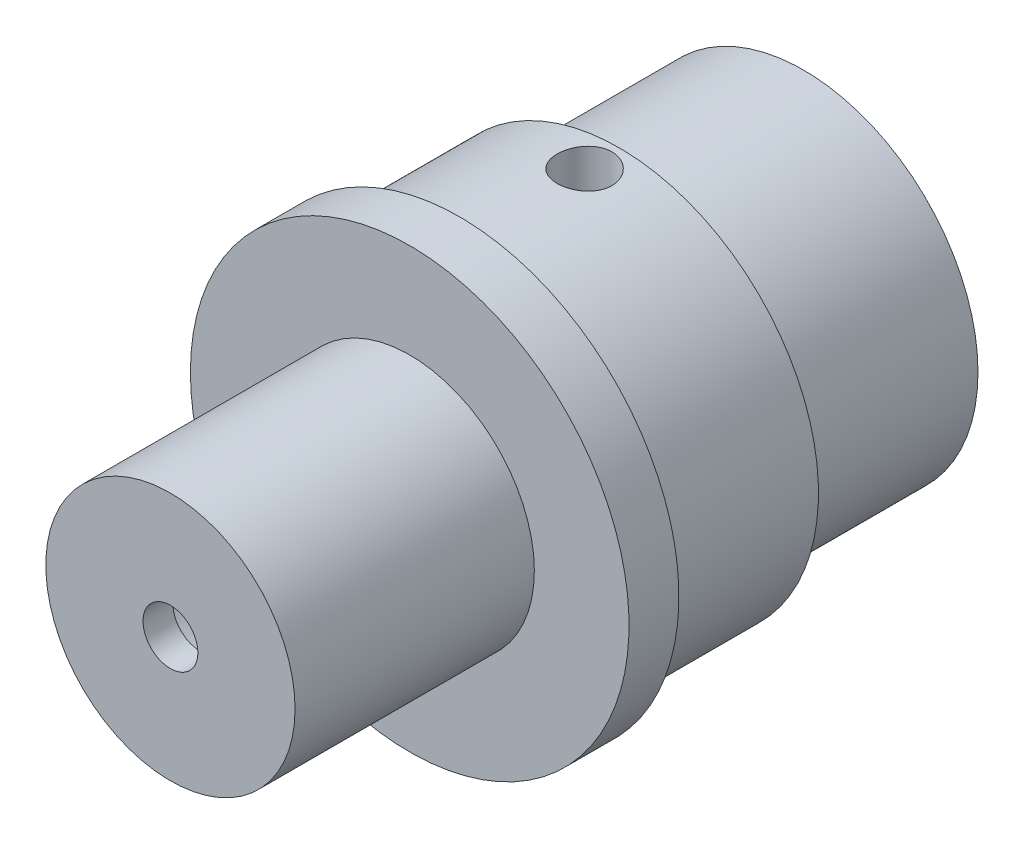
ISO-10303-21;
HEADER;
FILE_DESCRIPTION(('STEP AP214'),'2;1');
FILE_NAME('part.step','',(''),(''),'','','');
FILE_SCHEMA(('AUTOMOTIVE_DESIGN { 1 0 10303 214 1 1 1 1 }'));
ENDSEC;
DATA;
#1=APPLICATION_CONTEXT('core data for automotive mechanical design processes');
#2=APPLICATION_PROTOCOL_DEFINITION('international standard','automotive_design',2000,#1);
#3=PRODUCT_CONTEXT('',#1,'mechanical');
#4=PRODUCT('Part','Part','',(#3));
#5=PRODUCT_RELATED_PRODUCT_CATEGORY('part','',(#4));
#6=PRODUCT_DEFINITION_FORMATION('','',#4);
#7=PRODUCT_DEFINITION_CONTEXT('part definition',#1,'design');
#8=PRODUCT_DEFINITION('design','',#6,#7);
#9=PRODUCT_DEFINITION_SHAPE('','',#8);
#10=(LENGTH_UNIT() NAMED_UNIT(*) SI_UNIT(.MILLI.,.METRE.));
#11=(NAMED_UNIT(*) PLANE_ANGLE_UNIT() SI_UNIT($,.RADIAN.));
#12=(NAMED_UNIT(*) SI_UNIT($,.STERADIAN.) SOLID_ANGLE_UNIT());
#13=UNCERTAINTY_MEASURE_WITH_UNIT(LENGTH_MEASURE(1.E-05),#10,'distance_accuracy_value','');
#14=(GEOMETRIC_REPRESENTATION_CONTEXT(3) GLOBAL_UNCERTAINTY_ASSIGNED_CONTEXT((#13)) GLOBAL_UNIT_ASSIGNED_CONTEXT((#10,
#11,#12)) REPRESENTATION_CONTEXT('',''));
#15=CARTESIAN_POINT('',(0.,0.,0.));
#16=DIRECTION('',(0.,0.,1.));
#17=DIRECTION('',(1.,0.,0.));
#18=AXIS2_PLACEMENT_3D('',#15,#16,#17);
#19=CARTESIAN_POINT('',(0.,0.,-11.43));
#20=DIRECTION('',(0.,0.,1.));
#21=DIRECTION('',(1.,0.,0.));
#22=AXIS2_PLACEMENT_3D('',#19,#20,#21);
#23=CYLINDRICAL_SURFACE('',#22,5.08);
#24=CARTESIAN_POINT('',(0.,-5.08,-11.2484934942764));
#25=CARTESIAN_POINT('',(0.0390375262687286,-5.07999941272959,-11.2484918576947));
#26=CARTESIAN_POINT('',(0.0780986161636053,-5.0795452861682,-11.2452098794119));
#27=CARTESIAN_POINT('',(0.155131527725429,-5.07777737820298,-11.2321705549674));
#28=CARTESIAN_POINT('',(0.193102208167224,-5.07646272811566,-11.2224066652876));
#29=CARTESIAN_POINT('',(0.266828125286114,-5.07312170123751,-11.1966986234374));
#30=CARTESIAN_POINT('',(0.302584920142442,-5.0710958318732,-11.1807588766561));
#31=CARTESIAN_POINT('',(0.370909967486433,-5.06655698501941,-11.1431617850451));
#32=CARTESIAN_POINT('',(0.403478715843966,-5.06404408346484,-11.1215053313372));
#33=CARTESIAN_POINT('',(0.464724591745135,-5.05879262705098,-11.0729368040931));
#34=CARTESIAN_POINT('',(0.493377598826793,-5.05605282711134,-11.0459944456482));
#35=CARTESIAN_POINT('',(0.54577071894745,-5.05066626343523,-10.9876840196127));
#36=CARTESIAN_POINT('',(0.569510566734768,-5.04801950472826,-10.9563157132276));
#37=CARTESIAN_POINT('',(0.611495342848951,-5.04310655051595,-10.889884426031));
#38=CARTESIAN_POINT('',(0.629717306974492,-5.04084196235457,-10.8548068026288));
#39=CARTESIAN_POINT('',(0.660002362471861,-5.03696648870171,-10.7820527725401));
#40=CARTESIAN_POINT('',(0.672065735774185,-5.03535557328683,-10.744376484906));
#41=CARTESIAN_POINT('',(0.689617072387286,-5.0329819221891,-10.6677466790548));
#42=CARTESIAN_POINT('',(0.69514605480644,-5.03221389752567,-10.6288027226291));
#43=CARTESIAN_POINT('',(0.699598659986317,-5.03159687097224,-10.5505327414691));
#44=CARTESIAN_POINT('',(0.698522602438697,-5.03174782460261,-10.5112067353186));
#45=CARTESIAN_POINT('',(0.6898292720265,-5.03294685939326,-10.4335766948506));
#46=CARTESIAN_POINT('',(0.682257421076629,-5.03398871077676,-10.3952674640155));
#47=CARTESIAN_POINT('',(0.660858422083481,-5.03684242842108,-10.3204685234225));
#48=CARTESIAN_POINT('',(0.647031123148898,-5.03865431325628,-10.2839788575789));
#49=CARTESIAN_POINT('',(0.613465670662554,-5.04285092288327,-10.2137151375319));
#50=CARTESIAN_POINT('',(0.593708017728015,-5.04523753220732,-10.1799505154723));
#51=CARTESIAN_POINT('',(0.548856623097727,-5.05031327210738,-10.1161987770533));
#52=CARTESIAN_POINT('',(0.523762586487081,-5.05300241939926,-10.086211869615));
#53=CARTESIAN_POINT('',(0.46870016872473,-5.05840785329052,-10.0306033208738));
#54=CARTESIAN_POINT('',(0.438692682820889,-5.06112417839314,-10.0050203881291));
#55=CARTESIAN_POINT('',(0.374789157034967,-5.06625688962386,-9.95924819508514));
#56=CARTESIAN_POINT('',(0.340893104675094,-5.06867327478945,-9.93905895209407));
#57=CARTESIAN_POINT('',(0.270143012169057,-5.07293581168251,-9.90464627502185));
#58=CARTESIAN_POINT('',(0.233287646008855,-5.07478170596689,-9.89042553328864));
#59=CARTESIAN_POINT('',(0.157680984873464,-5.0776930430795,-9.86838565407741));
#60=CARTESIAN_POINT('',(0.118929797569997,-5.0787585301756,-9.86056615349203));
#61=CARTESIAN_POINT('',(0.0409658967689295,-5.07998319652894,-9.85160151442293));
#62=CARTESIAN_POINT('',(0.00175941794930083,-5.08014960924843,-9.8504031044794));
#63=CARTESIAN_POINT('',(-0.0762950688517972,-5.07957698336955,-9.85457369172792));
#64=CARTESIAN_POINT('',(-0.115143086087088,-5.07883796821142,-9.85994251890368));
#65=CARTESIAN_POINT('',(-0.191218714952706,-5.07654200805595,-9.87705090021269));
#66=CARTESIAN_POINT('',(-0.228452206316202,-5.07498835898738,-9.88876478911755));
#67=CARTESIAN_POINT('',(-0.300426526602626,-5.07123691380584,-9.91820391422853));
#68=CARTESIAN_POINT('',(-0.335167254976756,-5.0690390917275,-9.93592939275487));
#69=CARTESIAN_POINT('',(-0.401406056577425,-5.06422592094778,-9.97701555169009));
#70=CARTESIAN_POINT('',(-0.432882768252925,-5.06160807639177,-10.000410373456));
#71=CARTESIAN_POINT('',(-0.491482057827366,-5.05625482390376,-10.0521231945005));
#72=CARTESIAN_POINT('',(-0.51860442480919,-5.05351941028503,-10.0804414321227));
#73=CARTESIAN_POINT('',(-0.567916445405233,-5.04821670049812,-10.1414331090815));
#74=CARTESIAN_POINT('',(-0.590070592915827,-5.04565070152228,-10.1741353848028));
#75=CARTESIAN_POINT('',(-0.628571291591169,-5.04099948369398,-10.2428282093259));
#76=CARTESIAN_POINT('',(-0.644917979186405,-5.03891425354757,-10.2788186808556));
#77=CARTESIAN_POINT('',(-0.671283417222917,-5.03546979105325,-10.3529558566096));
#78=CARTESIAN_POINT('',(-0.681321547204083,-5.03410833730985,-10.3910955611976));
#79=CARTESIAN_POINT('',(-0.694847005117901,-5.03225943457924,-10.4685393613725));
#80=CARTESIAN_POINT('',(-0.698334707584455,-5.03177193562198,-10.5078433902562));
#81=CARTESIAN_POINT('',(-0.698652459064834,-5.03172779651615,-10.5861466129332));
#82=CARTESIAN_POINT('',(-0.695538307297131,-5.03216335463047,-10.6251455875166));
#83=CARTESIAN_POINT('',(-0.68285958633198,-5.03389939351279,-10.7020599012496));
#84=CARTESIAN_POINT('',(-0.673295021308895,-5.03519987372105,-10.7399752411004));
#85=CARTESIAN_POINT('',(-0.648005535641349,-5.03851666187555,-10.8136347610845));
#86=CARTESIAN_POINT('',(-0.632283887470973,-5.04053258951,-10.8493800829394));
#87=CARTESIAN_POINT('',(-0.595132006234607,-5.04505367138615,-10.917734497522));
#88=CARTESIAN_POINT('',(-0.573701642864476,-5.04755883679457,-10.9503435186391));
#89=CARTESIAN_POINT('',(-0.525535618236201,-5.05280142684748,-11.011784144563));
#90=CARTESIAN_POINT('',(-0.498758476081983,-5.05554056510384,-11.0405830874622));
#91=CARTESIAN_POINT('',(-0.440746343891878,-5.06092772637136,-11.0932992987245));
#92=CARTESIAN_POINT('',(-0.409510312106115,-5.06357572790991,-11.1172154231111));
#93=CARTESIAN_POINT('',(-0.343299989655058,-5.06849595879547,-11.159583226831));
#94=CARTESIAN_POINT('',(-0.308309174614122,-5.07076640479475,-11.1780092812121));
#95=CARTESIAN_POINT('',(-0.235716494362733,-5.07465798669092,-11.2086964321273));
#96=CARTESIAN_POINT('',(-0.198117451752904,-5.07627981204257,-11.2209640783341));
#97=CARTESIAN_POINT('',(-0.133613185663356,-5.07831030938487,-11.2361225272221));
#98=CARTESIAN_POINT('',(-0.107110842884322,-5.07894077720287,-11.2407547732743));
#99=CARTESIAN_POINT('',(-0.0537427209336393,-5.07978582267335,-11.2469408053677));
#100=CARTESIAN_POINT('',(-0.0268769452634482,-5.08000040432979,-11.2484946210465));
#101=CARTESIAN_POINT('',(0.,-5.08,-11.2484934942764));
#102=B_SPLINE_CURVE_WITH_KNOTS('',3,(#24,#25,#26,#27,#28,#29,#30,#31,#32,#33,#34,#35,#36,#37,
#38,#39,#40,#41,#42,#43,#44,#45,#46,#47,#48,#49,#50,#51,#52,#53,#54,#55,#56,#57,#58,#59,#60,#61,
#62,#63,#64,#65,#66,#67,#68,#69,#70,#71,#72,#73,#74,#75,#76,#77,#78,#79,#80,#81,#82,#83,#84,#85,
#86,#87,#88,#89,#90,#91,#92,#93,#94,#95,#96,#97,#98,#99,#100,#101),.UNSPECIFIED.,.T.,.F.,(4,2,2,
2,2,2,2,2,2,2,2,2,2,2,2,2,2,2,2,2,2,2,2,2,2,2,2,2,2,2,2,2,2,2,2,2,2,2,4),(0.,0.11701438792192,
0.234147082379352,0.351196376608856,0.468227435924392,0.585949695024366,0.703678308057578,
0.821890352564153,0.94009698502593,1.05755757559369,1.17501248097635,1.29165271415147,
1.40829576102362,1.52532661917782,1.6423639467164,1.76038257154902,1.87840157509524,
1.99647375909329,2.11453924503851,2.231653410127,2.34876454336264,2.46540547151005,
2.58205110187747,2.69941744691759,2.81678947527154,2.93497533067318,3.05315840943572,
3.17097663853362,3.28878813093158,3.40560784619906,3.52242748586716,3.63918512027334,
3.75594541995646,3.87364945367107,3.99138103223941,4.1096538123731,4.2278005375429,
4.30836454552825,4.3889277778797),.UNSPECIFIED.);
#103=CARTESIAN_POINT('',(0.,-5.08,-11.2484934942764));
#104=VERTEX_POINT('',#103);
#105=EDGE_CURVE('E76',#104,#104,#102,.T.);
#106=ORIENTED_EDGE('',*,*,#105,.F.);
#107=EDGE_LOOP('',(#106));
#108=FACE_BOUND('',#107,.T.);
#109=CARTESIAN_POINT('',(0.,0.,-11.43));
#110=DIRECTION('',(0.,0.,-1.));
#111=DIRECTION('',(-1.,0.,0.));
#112=AXIS2_PLACEMENT_3D('',#109,#110,#111);
#113=CIRCLE('',#112,5.08);
#114=CARTESIAN_POINT('',(-5.08,0.,-11.43));
#115=VERTEX_POINT('',#114);
#116=EDGE_CURVE('E135',#115,#115,#113,.T.);
#117=ORIENTED_EDGE('',*,*,#116,.F.);
#118=EDGE_LOOP('',(#117));
#119=FACE_BOUND('',#118,.T.);
#120=CARTESIAN_POINT('',(0.,0.,-7.366));
#121=DIRECTION('',(0.,0.,-1.));
#122=DIRECTION('',(-1.,0.,0.));
#123=AXIS2_PLACEMENT_3D('',#120,#121,#122);
#124=CIRCLE('',#123,5.08);
#125=CARTESIAN_POINT('',(-5.08,0.,-7.366));
#126=VERTEX_POINT('',#125);
#127=EDGE_CURVE('E132',#126,#126,#124,.T.);
#128=ORIENTED_EDGE('',*,*,#127,.T.);
#129=EDGE_LOOP('',(#128));
#130=FACE_BOUND('',#129,.T.);
#131=CARTESIAN_POINT('',(0.,5.08,-11.2484934942764));
#132=CARTESIAN_POINT('',(-0.0390375262687286,5.07999941272959,-11.2484918576947));
#133=CARTESIAN_POINT('',(-0.0780986161636053,5.0795452861682,-11.2452098794119));
#134=CARTESIAN_POINT('',(-0.155131527725429,5.07777737820298,-11.2321705549674));
#135=CARTESIAN_POINT('',(-0.193102208167224,5.07646272811566,-11.2224066652876));
#136=CARTESIAN_POINT('',(-0.266828125286114,5.07312170123751,-11.1966986234374));
#137=CARTESIAN_POINT('',(-0.302584920142442,5.0710958318732,-11.1807588766561));
#138=CARTESIAN_POINT('',(-0.370909967486433,5.06655698501941,-11.1431617850451));
#139=CARTESIAN_POINT('',(-0.403478715843966,5.06404408346484,-11.1215053313372));
#140=CARTESIAN_POINT('',(-0.464724591745135,5.05879262705098,-11.0729368040931));
#141=CARTESIAN_POINT('',(-0.493377598826793,5.05605282711134,-11.0459944456482));
#142=CARTESIAN_POINT('',(-0.54577071894745,5.05066626343523,-10.9876840196127));
#143=CARTESIAN_POINT('',(-0.569510566734768,5.04801950472826,-10.9563157132276));
#144=CARTESIAN_POINT('',(-0.611495342848951,5.04310655051595,-10.889884426031));
#145=CARTESIAN_POINT('',(-0.629717306974492,5.04084196235457,-10.8548068026288));
#146=CARTESIAN_POINT('',(-0.660002362471861,5.03696648870171,-10.7820527725401));
#147=CARTESIAN_POINT('',(-0.672065735774185,5.03535557328683,-10.744376484906));
#148=CARTESIAN_POINT('',(-0.689617072387286,5.0329819221891,-10.6677466790548));
#149=CARTESIAN_POINT('',(-0.69514605480644,5.03221389752567,-10.6288027226291));
#150=CARTESIAN_POINT('',(-0.699598659986317,5.03159687097224,-10.5505327414691));
#151=CARTESIAN_POINT('',(-0.698522602438697,5.03174782460261,-10.5112067353186));
#152=CARTESIAN_POINT('',(-0.6898292720265,5.03294685939326,-10.4335766948506));
#153=CARTESIAN_POINT('',(-0.682257421076629,5.03398871077676,-10.3952674640155));
#154=CARTESIAN_POINT('',(-0.660858422083481,5.03684242842108,-10.3204685234225));
#155=CARTESIAN_POINT('',(-0.647031123148898,5.03865431325628,-10.2839788575789));
#156=CARTESIAN_POINT('',(-0.613465670662554,5.04285092288327,-10.2137151375319));
#157=CARTESIAN_POINT('',(-0.593708017728015,5.04523753220732,-10.1799505154723));
#158=CARTESIAN_POINT('',(-0.548856623097727,5.05031327210738,-10.1161987770533));
#159=CARTESIAN_POINT('',(-0.523762586487081,5.05300241939926,-10.086211869615));
#160=CARTESIAN_POINT('',(-0.46870016872473,5.05840785329052,-10.0306033208738));
#161=CARTESIAN_POINT('',(-0.438692682820889,5.06112417839314,-10.0050203881291));
#162=CARTESIAN_POINT('',(-0.374789157034967,5.06625688962386,-9.95924819508514));
#163=CARTESIAN_POINT('',(-0.340893104675094,5.06867327478945,-9.93905895209407));
#164=CARTESIAN_POINT('',(-0.270143012169057,5.07293581168251,-9.90464627502185));
#165=CARTESIAN_POINT('',(-0.233287646008855,5.07478170596689,-9.89042553328864));
#166=CARTESIAN_POINT('',(-0.157680984873464,5.0776930430795,-9.86838565407741));
#167=CARTESIAN_POINT('',(-0.118929797569997,5.0787585301756,-9.86056615349203));
#168=CARTESIAN_POINT('',(-0.0409658967689295,5.07998319652894,-9.85160151442293));
#169=CARTESIAN_POINT('',(-0.00175941794930083,5.08014960924843,-9.8504031044794));
#170=CARTESIAN_POINT('',(0.0762950688517972,5.07957698336955,-9.85457369172792));
#171=CARTESIAN_POINT('',(0.115143086087088,5.07883796821142,-9.85994251890368));
#172=CARTESIAN_POINT('',(0.191218714952706,5.07654200805595,-9.87705090021269));
#173=CARTESIAN_POINT('',(0.228452206316202,5.07498835898738,-9.88876478911755));
#174=CARTESIAN_POINT('',(0.300426526602626,5.07123691380584,-9.91820391422853));
#175=CARTESIAN_POINT('',(0.335167254976756,5.0690390917275,-9.93592939275487));
#176=CARTESIAN_POINT('',(0.401406056577425,5.06422592094778,-9.97701555169009));
#177=CARTESIAN_POINT('',(0.432882768252925,5.06160807639177,-10.000410373456));
#178=CARTESIAN_POINT('',(0.491482057827366,5.05625482390376,-10.0521231945005));
#179=CARTESIAN_POINT('',(0.51860442480919,5.05351941028503,-10.0804414321227));
#180=CARTESIAN_POINT('',(0.567916445405233,5.04821670049812,-10.1414331090815));
#181=CARTESIAN_POINT('',(0.590070592915827,5.04565070152228,-10.1741353848028));
#182=CARTESIAN_POINT('',(0.628571291591169,5.04099948369398,-10.2428282093259));
#183=CARTESIAN_POINT('',(0.644917979186405,5.03891425354757,-10.2788186808556));
#184=CARTESIAN_POINT('',(0.671283417222917,5.03546979105325,-10.3529558566096));
#185=CARTESIAN_POINT('',(0.681321547204083,5.03410833730985,-10.3910955611976));
#186=CARTESIAN_POINT('',(0.694847005117901,5.03225943457924,-10.4685393613725));
#187=CARTESIAN_POINT('',(0.698334707584455,5.03177193562198,-10.5078433902562));
#188=CARTESIAN_POINT('',(0.698652459064834,5.03172779651615,-10.5861466129332));
#189=CARTESIAN_POINT('',(0.695538307297131,5.03216335463047,-10.6251455875166));
#190=CARTESIAN_POINT('',(0.68285958633198,5.03389939351279,-10.7020599012496));
#191=CARTESIAN_POINT('',(0.673295021308895,5.03519987372105,-10.7399752411004));
#192=CARTESIAN_POINT('',(0.648005535641349,5.03851666187555,-10.8136347610845));
#193=CARTESIAN_POINT('',(0.632283887470973,5.04053258951,-10.8493800829394));
#194=CARTESIAN_POINT('',(0.595132006234607,5.04505367138615,-10.917734497522));
#195=CARTESIAN_POINT('',(0.573701642864476,5.04755883679457,-10.9503435186391));
#196=CARTESIAN_POINT('',(0.525535618236201,5.05280142684748,-11.011784144563));
#197=CARTESIAN_POINT('',(0.498758476081983,5.05554056510384,-11.0405830874622));
#198=CARTESIAN_POINT('',(0.440746343891878,5.06092772637136,-11.0932992987245));
#199=CARTESIAN_POINT('',(0.409510312106115,5.06357572790991,-11.1172154231111));
#200=CARTESIAN_POINT('',(0.343299989655058,5.06849595879547,-11.159583226831));
#201=CARTESIAN_POINT('',(0.308309174614122,5.07076640479475,-11.1780092812121));
#202=CARTESIAN_POINT('',(0.235716494362733,5.07465798669092,-11.2086964321273));
#203=CARTESIAN_POINT('',(0.198117451752904,5.07627981204257,-11.2209640783341));
#204=CARTESIAN_POINT('',(0.133613185663356,5.07831030938487,-11.2361225272221));
#205=CARTESIAN_POINT('',(0.107110842884322,5.07894077720287,-11.2407547732743));
#206=CARTESIAN_POINT('',(0.0537427209336393,5.07978582267335,-11.2469408053677));
#207=CARTESIAN_POINT('',(0.0268769452634482,5.08000040432979,-11.2484946210465));
#208=CARTESIAN_POINT('',(0.,5.08,-11.2484934942764));
#209=B_SPLINE_CURVE_WITH_KNOTS('',3,(#131,#132,#133,#134,#135,#136,#137,#138,#139,#140,#141,
#142,#143,#144,#145,#146,#147,#148,#149,#150,#151,#152,#153,#154,#155,#156,#157,#158,#159,#160,
#161,#162,#163,#164,#165,#166,#167,#168,#169,#170,#171,#172,#173,#174,#175,#176,#177,#178,#179,
#180,#181,#182,#183,#184,#185,#186,#187,#188,#189,#190,#191,#192,#193,#194,#195,#196,#197,#198,
#199,#200,#201,#202,#203,#204,#205,#206,#207,#208),.UNSPECIFIED.,.T.,.F.,(4,2,2,2,2,2,2,2,2,2,2,
2,2,2,2,2,2,2,2,2,2,2,2,2,2,2,2,2,2,2,2,2,2,2,2,2,2,2,4),(0.,0.11701438792192,0.234147082379352,
0.351196376608856,0.468227435924392,0.585949695024366,0.703678308057578,0.821890352564153,
0.94009698502593,1.05755757559369,1.17501248097635,1.29165271415147,1.40829576102362,
1.52532661917782,1.6423639467164,1.76038257154902,1.87840157509524,1.99647375909329,
2.11453924503851,2.231653410127,2.34876454336264,2.46540547151005,2.58205110187747,
2.69941744691759,2.81678947527154,2.93497533067318,3.05315840943572,3.17097663853362,
3.28878813093158,3.40560784619906,3.52242748586716,3.63918512027334,3.75594541995646,
3.87364945367107,3.99138103223941,4.1096538123731,4.2278005375429,4.30836454552825,
4.3889277778797),.UNSPECIFIED.);
#210=CARTESIAN_POINT('',(0.,5.08,-11.2484934942764));
#211=VERTEX_POINT('',#210);
#212=EDGE_CURVE('E81',#211,#211,#209,.T.);
#213=ORIENTED_EDGE('',*,*,#212,.F.);
#214=EDGE_LOOP('',(#213));
#215=FACE_BOUND('',#214,.T.);
#216=ADVANCED_FACE('F30',(#108,#119,#130,#215),#23,.T.);
#217=CARTESIAN_POINT('',(0.,0.,-9.017));
#218=DIRECTION('',(0.,0.,-1.));
#219=DIRECTION('',(-1.,0.,0.));
#220=AXIS2_PLACEMENT_3D('',#217,#218,#219);
#221=CYLINDRICAL_SURFACE('',#220,3.3655);
#222=CARTESIAN_POINT('',(0.,-3.3655,-11.2484934942764));
#223=CARTESIAN_POINT('',(-0.0387891025257068,-3.36549928213888,-11.2484921055436));
#224=CARTESIAN_POINT('',(-0.0775954497331706,-3.36482254769785,-11.2452515253168));
#225=CARTESIAN_POINT('',(-0.154109129985763,-3.36218822923295,-11.2323863589914));
#226=CARTESIAN_POINT('',(-0.191815601469721,-3.36022966784907,-11.2227569014612));
#227=CARTESIAN_POINT('',(-0.265012397192366,-3.35525014969272,-11.1974259746682));
#228=CARTESIAN_POINT('',(-0.300504879658052,-3.35223024720745,-11.1817305295404));
#229=CARTESIAN_POINT('',(-0.368350744543305,-3.34545540933652,-11.1447315520891));
#230=CARTESIAN_POINT('',(-0.400704271916896,-3.34170050791662,-11.1234282788987));
#231=CARTESIAN_POINT('',(-0.461825892173336,-3.3338071813921,-11.0754904482117));
#232=CARTESIAN_POINT('',(-0.490541821789646,-3.32966439957856,-11.0487900926953));
#233=CARTESIAN_POINT('',(-0.543121181427906,-3.32149352944443,-10.9909573950308));
#234=CARTESIAN_POINT('',(-0.566984212067351,-3.31746545058709,-10.9598246884683));
#235=CARTESIAN_POINT('',(-0.609405610227011,-3.30993736373981,-10.8936316947576));
#236=CARTESIAN_POINT('',(-0.627909367549772,-3.30644295269204,-10.8585357162552));
#237=CARTESIAN_POINT('',(-0.658736940351676,-3.30043999468949,-10.7856481837703));
#238=CARTESIAN_POINT('',(-0.671061416300236,-3.29793134237859,-10.7478569183657));
#239=CARTESIAN_POINT('',(-0.689010032408537,-3.29422814047847,-10.6712146457844));
#240=CARTESIAN_POINT('',(-0.694726026871895,-3.29301559409781,-10.6323860373338));
#241=CARTESIAN_POINT('',(-0.699580851799557,-3.29198777216251,-10.554303478079));
#242=CARTESIAN_POINT('',(-0.698720407797047,-3.29217234247358,-10.5150495746719));
#243=CARTESIAN_POINT('',(-0.690520909481465,-3.29390157107152,-10.4379069495613));
#244=CARTESIAN_POINT('',(-0.683287701512003,-3.29542400744594,-10.4000064045505));
#245=CARTESIAN_POINT('',(-0.662715316553289,-3.29962238193045,-10.3259687187048));
#246=CARTESIAN_POINT('',(-0.649375827822512,-3.3022983789324,-10.289831668005));
#247=CARTESIAN_POINT('',(-0.616870003949758,-3.30852475341596,-10.2200446759846));
#248=CARTESIAN_POINT('',(-0.597662209645762,-3.31208131699237,-10.1864146206022));
#249=CARTESIAN_POINT('',(-0.553994225323938,-3.31966418899463,-10.1228154799707));
#250=CARTESIAN_POINT('',(-0.529533387318759,-3.32369055534482,-10.0928468470914));
#251=CARTESIAN_POINT('',(-0.47548947250351,-3.33185527209451,-10.0368110205464));
#252=CARTESIAN_POINT('',(-0.445816185995574,-3.33599427915075,-10.0108308476178));
#253=CARTESIAN_POINT('',(-0.382488163232085,-3.34384650528562,-9.96420240630812));
#254=CARTESIAN_POINT('',(-0.348833368111646,-3.34755971806746,-9.9435542167724));
#255=CARTESIAN_POINT('',(-0.278397255013528,-3.35415220828125,-9.90815766215517));
#256=CARTESIAN_POINT('',(-0.241610503051296,-3.35702999647199,-9.89341981532814));
#257=CARTESIAN_POINT('',(-0.1660099789902,-3.36161618734478,-9.87035815411691));
#258=CARTESIAN_POINT('',(-0.127196472406998,-3.36332474279093,-9.86203350180979));
#259=CARTESIAN_POINT('',(-0.0493914742329857,-3.36535850096739,-9.85215905847287));
#260=CARTESIAN_POINT('',(-0.0104157016236798,-3.3657079998044,-9.85049026533983));
#261=CARTESIAN_POINT('',(0.067257715995932,-3.36505198591969,-9.8536536140412));
#262=CARTESIAN_POINT('',(0.105955377758265,-3.36404655551174,-9.85848536095905));
#263=CARTESIAN_POINT('',(0.181586099636317,-3.36080890861583,-9.87441383373173));
#264=CARTESIAN_POINT('',(0.218532694032608,-3.35858875888343,-9.88544896563912));
#265=CARTESIAN_POINT('',(0.290050901561576,-3.35316985765934,-9.9134032388337));
#266=CARTESIAN_POINT('',(0.324622326551787,-3.34997102875347,-9.93032284560122));
#267=CARTESIAN_POINT('',(0.390906879471191,-3.34288928473191,-9.96981948345123));
#268=CARTESIAN_POINT('',(0.42257680675502,-3.33899798510044,-9.99246747948511));
#269=CARTESIAN_POINT('',(0.481709375708222,-3.33098158765554,-10.0426836060841));
#270=CARTESIAN_POINT('',(0.5091715283439,-3.32685646274282,-10.070252307736));
#271=CARTESIAN_POINT('',(0.559572715095951,-3.31875464289944,-10.1300707758444));
#272=CARTESIAN_POINT('',(0.582429765626072,-3.31478151360811,-10.1623901878291));
#273=CARTESIAN_POINT('',(0.622391340806538,-3.30751167702148,-10.2304793412348));
#274=CARTESIAN_POINT('',(0.639496104144505,-3.30421494166184,-10.2662489394132));
#275=CARTESIAN_POINT('',(0.667358416386124,-3.29870049419438,-10.3400374202345));
#276=CARTESIAN_POINT('',(0.678150106338564,-3.29647698971691,-10.3780429575016));
#277=CARTESIAN_POINT('',(0.693182202678674,-3.29334916148341,-10.4553794077746));
#278=CARTESIAN_POINT('',(0.69742353819029,-3.29244465063796,-10.4947101320026));
#279=CARTESIAN_POINT('',(0.699198093706792,-3.29206816570666,-10.572756051638));
#280=CARTESIAN_POINT('',(0.696861025338564,-3.29256849086679,-10.6114682216524));
#281=CARTESIAN_POINT('',(0.685832845809197,-3.29488311522654,-10.6879345603874));
#282=CARTESIAN_POINT('',(0.677141794653745,-3.29669740201738,-10.7256887381515));
#283=CARTESIAN_POINT('',(0.653712140907288,-3.301422694695,-10.7990767954453));
#284=CARTESIAN_POINT('',(0.638990615203286,-3.3043306018168,-10.8347163394849));
#285=CARTESIAN_POINT('',(0.603933286436373,-3.31091702591278,-10.9030395529815));
#286=CARTESIAN_POINT('',(0.583596966962193,-3.31459561376154,-10.9357229501845));
#287=CARTESIAN_POINT('',(0.537449325388436,-3.32239288512395,-10.9978494867171));
#288=CARTESIAN_POINT('',(0.511544806268512,-3.32651837851068,-11.0272225574911));
#289=CARTESIAN_POINT('',(0.45518715887077,-3.3346969990936,-11.0812476027794));
#290=CARTESIAN_POINT('',(0.424732985049415,-3.33875010941531,-11.1058984891219));
#291=CARTESIAN_POINT('',(0.359721718470156,-3.34638204567612,-11.1500469854642));
#292=CARTESIAN_POINT('',(0.325121713457634,-3.34995492192954,-11.1694824821084));
#293=CARTESIAN_POINT('',(0.253081034088159,-3.35616486465845,-11.2022319090801));
#294=CARTESIAN_POINT('',(0.2156428845016,-3.35880275129894,-11.2155512075317));
#295=CARTESIAN_POINT('',(0.148448612676734,-3.3623493373043,-11.2331908746206));
#296=CARTESIAN_POINT('',(0.119067875511194,-3.3635237645774,-11.2389188483225));
#297=CARTESIAN_POINT('',(0.0597948292084358,-3.3650993585351,-11.2465706241205));
#298=CARTESIAN_POINT('',(0.0299025387543966,-3.3655005533995,-11.2484945648513));
#299=CARTESIAN_POINT('',(0.,-3.3655,-11.2484934942764));
#300=B_SPLINE_CURVE_WITH_KNOTS('',3,(#222,#223,#224,#225,#226,#227,#228,#229,#230,#231,#232,
#233,#234,#235,#236,#237,#238,#239,#240,#241,#242,#243,#244,#245,#246,#247,#248,#249,#250,#251,
#252,#253,#254,#255,#256,#257,#258,#259,#260,#261,#262,#263,#264,#265,#266,#267,#268,#269,#270,
#271,#272,#273,#274,#275,#276,#277,#278,#279,#280,#281,#282,#283,#284,#285,#286,#287,#288,#289,
#290,#291,#292,#293,#294,#295,#296,#297,#298,#299),.UNSPECIFIED.,.T.,.F.,(4,2,2,2,2,2,2,2,2,2,2,
2,2,2,2,2,2,2,2,2,2,2,2,2,2,2,2,2,2,2,2,2,2,2,2,2,2,2,4),(0.,0.11625789082696,0.232604528733603,
0.348835918416897,0.465061938085505,0.582801124107748,0.700549995878442,0.819459591481173,
0.938356474780046,1.05558009730881,1.17279078754893,1.28809064839435,1.40339639625433,
1.51953638502269,1.63569070843589,1.75409966011347,1.87251036263512,1.99113086772088,
2.10973587168555,2.22621053183255,2.34267811630661,2.45800920622731,2.57334942127292,
2.69019520239939,2.8070545532287,2.92583940463653,3.04461932653158,3.16275080301983,
3.2808655218092,3.39666768524377,3.51246875508098,3.62794414578682,3.7434301606886,
3.86102505180568,3.97864700876792,4.09761319734979,4.21647477001535,4.30610130327454,
4.39572457010969),.UNSPECIFIED.);
#301=CARTESIAN_POINT('',(0.,-3.3655,-11.2484934942764));
#302=VERTEX_POINT('',#301);
#303=EDGE_CURVE('E55',#302,#302,#300,.T.);
#304=ORIENTED_EDGE('',*,*,#303,.F.);
#305=EDGE_LOOP('',(#304));
#306=FACE_BOUND('',#305,.T.);
#307=CARTESIAN_POINT('',(0.,0.,-9.017));
#308=DIRECTION('',(0.,0.,-1.));
#309=DIRECTION('',(-1.,0.,0.));
#310=AXIS2_PLACEMENT_3D('',#307,#308,#309);
#311=CIRCLE('',#310,3.3655);
#312=CARTESIAN_POINT('',(-3.3655,0.,-9.017));
#313=VERTEX_POINT('',#312);
#314=EDGE_CURVE('E123',#313,#313,#311,.T.);
#315=ORIENTED_EDGE('',*,*,#314,.F.);
#316=EDGE_LOOP('',(#315));
#317=FACE_BOUND('',#316,.T.);
#318=CARTESIAN_POINT('',(0.,0.,-16.129));
#319=DIRECTION('',(0.,0.,-1.));
#320=DIRECTION('',(-1.,0.,0.));
#321=AXIS2_PLACEMENT_3D('',#318,#319,#320);
#322=CIRCLE('',#321,3.3655);
#323=CARTESIAN_POINT('',(-3.3655,0.,-16.129));
#324=VERTEX_POINT('',#323);
#325=EDGE_CURVE('E120',#324,#324,#322,.T.);
#326=ORIENTED_EDGE('',*,*,#325,.T.);
#327=EDGE_LOOP('',(#326));
#328=FACE_BOUND('',#327,.T.);
#329=CARTESIAN_POINT('',(0.,3.3655,-11.2484934942764));
#330=CARTESIAN_POINT('',(0.0387891025257068,3.36549928213888,-11.2484921055436));
#331=CARTESIAN_POINT('',(0.0775954497331706,3.36482254769785,-11.2452515253168));
#332=CARTESIAN_POINT('',(0.154109129985763,3.36218822923295,-11.2323863589914));
#333=CARTESIAN_POINT('',(0.191815601469721,3.36022966784907,-11.2227569014612));
#334=CARTESIAN_POINT('',(0.265012397192366,3.35525014969272,-11.1974259746682));
#335=CARTESIAN_POINT('',(0.300504879658052,3.35223024720745,-11.1817305295404));
#336=CARTESIAN_POINT('',(0.368350744543305,3.34545540933652,-11.1447315520891));
#337=CARTESIAN_POINT('',(0.400704271916896,3.34170050791662,-11.1234282788987));
#338=CARTESIAN_POINT('',(0.461825892173336,3.3338071813921,-11.0754904482117));
#339=CARTESIAN_POINT('',(0.490541821789646,3.32966439957856,-11.0487900926953));
#340=CARTESIAN_POINT('',(0.543121181427906,3.32149352944443,-10.9909573950308));
#341=CARTESIAN_POINT('',(0.566984212067351,3.31746545058709,-10.9598246884683));
#342=CARTESIAN_POINT('',(0.609405610227011,3.30993736373981,-10.8936316947576));
#343=CARTESIAN_POINT('',(0.627909367549772,3.30644295269204,-10.8585357162552));
#344=CARTESIAN_POINT('',(0.658736940351676,3.30043999468949,-10.7856481837703));
#345=CARTESIAN_POINT('',(0.671061416300236,3.29793134237859,-10.7478569183657));
#346=CARTESIAN_POINT('',(0.689010032408537,3.29422814047847,-10.6712146457844));
#347=CARTESIAN_POINT('',(0.694726026871895,3.29301559409781,-10.6323860373338));
#348=CARTESIAN_POINT('',(0.699580851799557,3.29198777216251,-10.554303478079));
#349=CARTESIAN_POINT('',(0.698720407797047,3.29217234247358,-10.5150495746719));
#350=CARTESIAN_POINT('',(0.690520909481465,3.29390157107152,-10.4379069495613));
#351=CARTESIAN_POINT('',(0.683287701512003,3.29542400744594,-10.4000064045505));
#352=CARTESIAN_POINT('',(0.662715316553289,3.29962238193045,-10.3259687187048));
#353=CARTESIAN_POINT('',(0.649375827822512,3.3022983789324,-10.289831668005));
#354=CARTESIAN_POINT('',(0.616870003949758,3.30852475341596,-10.2200446759846));
#355=CARTESIAN_POINT('',(0.597662209645762,3.31208131699237,-10.1864146206022));
#356=CARTESIAN_POINT('',(0.553994225323938,3.31966418899463,-10.1228154799707));
#357=CARTESIAN_POINT('',(0.529533387318759,3.32369055534482,-10.0928468470914));
#358=CARTESIAN_POINT('',(0.47548947250351,3.33185527209451,-10.0368110205464));
#359=CARTESIAN_POINT('',(0.445816185995574,3.33599427915075,-10.0108308476178));
#360=CARTESIAN_POINT('',(0.382488163232085,3.34384650528562,-9.96420240630812));
#361=CARTESIAN_POINT('',(0.348833368111646,3.34755971806746,-9.9435542167724));
#362=CARTESIAN_POINT('',(0.278397255013528,3.35415220828125,-9.90815766215517));
#363=CARTESIAN_POINT('',(0.241610503051296,3.35702999647199,-9.89341981532814));
#364=CARTESIAN_POINT('',(0.1660099789902,3.36161618734478,-9.87035815411691));
#365=CARTESIAN_POINT('',(0.127196472406998,3.36332474279093,-9.86203350180979));
#366=CARTESIAN_POINT('',(0.0493914742329857,3.36535850096739,-9.85215905847287));
#367=CARTESIAN_POINT('',(0.0104157016236798,3.3657079998044,-9.85049026533983));
#368=CARTESIAN_POINT('',(-0.067257715995932,3.36505198591969,-9.8536536140412));
#369=CARTESIAN_POINT('',(-0.105955377758265,3.36404655551174,-9.85848536095905));
#370=CARTESIAN_POINT('',(-0.181586099636317,3.36080890861583,-9.87441383373173));
#371=CARTESIAN_POINT('',(-0.218532694032608,3.35858875888343,-9.88544896563912));
#372=CARTESIAN_POINT('',(-0.290050901561576,3.35316985765934,-9.9134032388337));
#373=CARTESIAN_POINT('',(-0.324622326551787,3.34997102875347,-9.93032284560122));
#374=CARTESIAN_POINT('',(-0.390906879471191,3.34288928473191,-9.96981948345123));
#375=CARTESIAN_POINT('',(-0.42257680675502,3.33899798510044,-9.99246747948511));
#376=CARTESIAN_POINT('',(-0.481709375708222,3.33098158765554,-10.0426836060841));
#377=CARTESIAN_POINT('',(-0.5091715283439,3.32685646274282,-10.070252307736));
#378=CARTESIAN_POINT('',(-0.559572715095951,3.31875464289944,-10.1300707758444));
#379=CARTESIAN_POINT('',(-0.582429765626072,3.31478151360811,-10.1623901878291));
#380=CARTESIAN_POINT('',(-0.622391340806538,3.30751167702148,-10.2304793412348));
#381=CARTESIAN_POINT('',(-0.639496104144505,3.30421494166184,-10.2662489394132));
#382=CARTESIAN_POINT('',(-0.667358416386124,3.29870049419438,-10.3400374202345));
#383=CARTESIAN_POINT('',(-0.678150106338564,3.29647698971691,-10.3780429575016));
#384=CARTESIAN_POINT('',(-0.693182202678674,3.29334916148341,-10.4553794077746));
#385=CARTESIAN_POINT('',(-0.69742353819029,3.29244465063796,-10.4947101320026));
#386=CARTESIAN_POINT('',(-0.699198093706792,3.29206816570666,-10.572756051638));
#387=CARTESIAN_POINT('',(-0.696861025338564,3.29256849086679,-10.6114682216524));
#388=CARTESIAN_POINT('',(-0.685832845809197,3.29488311522654,-10.6879345603874));
#389=CARTESIAN_POINT('',(-0.677141794653745,3.29669740201738,-10.7256887381515));
#390=CARTESIAN_POINT('',(-0.653712140907288,3.301422694695,-10.7990767954453));
#391=CARTESIAN_POINT('',(-0.638990615203286,3.3043306018168,-10.8347163394849));
#392=CARTESIAN_POINT('',(-0.603933286436373,3.31091702591278,-10.9030395529815));
#393=CARTESIAN_POINT('',(-0.583596966962193,3.31459561376154,-10.9357229501845));
#394=CARTESIAN_POINT('',(-0.537449325388436,3.32239288512395,-10.9978494867171));
#395=CARTESIAN_POINT('',(-0.511544806268512,3.32651837851068,-11.0272225574911));
#396=CARTESIAN_POINT('',(-0.45518715887077,3.3346969990936,-11.0812476027794));
#397=CARTESIAN_POINT('',(-0.424732985049415,3.33875010941531,-11.1058984891219));
#398=CARTESIAN_POINT('',(-0.359721718470156,3.34638204567612,-11.1500469854642));
#399=CARTESIAN_POINT('',(-0.325121713457634,3.34995492192954,-11.1694824821084));
#400=CARTESIAN_POINT('',(-0.253081034088159,3.35616486465845,-11.2022319090801));
#401=CARTESIAN_POINT('',(-0.2156428845016,3.35880275129894,-11.2155512075317));
#402=CARTESIAN_POINT('',(-0.148448612676734,3.3623493373043,-11.2331908746206));
#403=CARTESIAN_POINT('',(-0.119067875511194,3.3635237645774,-11.2389188483225));
#404=CARTESIAN_POINT('',(-0.0597948292084358,3.3650993585351,-11.2465706241205));
#405=CARTESIAN_POINT('',(-0.0299025387543966,3.3655005533995,-11.2484945648513));
#406=CARTESIAN_POINT('',(0.,3.3655,-11.2484934942764));
#407=B_SPLINE_CURVE_WITH_KNOTS('',3,(#329,#330,#331,#332,#333,#334,#335,#336,#337,#338,#339,
#340,#341,#342,#343,#344,#345,#346,#347,#348,#349,#350,#351,#352,#353,#354,#355,#356,#357,#358,
#359,#360,#361,#362,#363,#364,#365,#366,#367,#368,#369,#370,#371,#372,#373,#374,#375,#376,#377,
#378,#379,#380,#381,#382,#383,#384,#385,#386,#387,#388,#389,#390,#391,#392,#393,#394,#395,#396,
#397,#398,#399,#400,#401,#402,#403,#404,#405,#406),.UNSPECIFIED.,.T.,.F.,(4,2,2,2,2,2,2,2,2,2,2,
2,2,2,2,2,2,2,2,2,2,2,2,2,2,2,2,2,2,2,2,2,2,2,2,2,2,2,4),(0.,0.11625789082696,0.232604528733603,
0.348835918416897,0.465061938085505,0.582801124107748,0.700549995878442,0.819459591481173,
0.938356474780046,1.05558009730881,1.17279078754893,1.28809064839435,1.40339639625433,
1.51953638502269,1.63569070843589,1.75409966011347,1.87251036263512,1.99113086772088,
2.10973587168555,2.22621053183255,2.34267811630661,2.45800920622731,2.57334942127292,
2.69019520239939,2.8070545532287,2.92583940463653,3.04461932653158,3.16275080301983,
3.2808655218092,3.39666768524377,3.51246875508098,3.62794414578682,3.7434301606886,
3.86102505180568,3.97864700876792,4.09761319734979,4.21647477001535,4.30610130327454,
4.39572457010969),.UNSPECIFIED.);
#408=CARTESIAN_POINT('',(0.,3.3655,-11.2484934942764));
#409=VERTEX_POINT('',#408);
#410=EDGE_CURVE('E34',#409,#409,#407,.T.);
#411=ORIENTED_EDGE('',*,*,#410,.F.);
#412=EDGE_LOOP('',(#411));
#413=FACE_BOUND('',#412,.T.);
#414=ADVANCED_FACE('F59',(#306,#317,#328,#413),#221,.F.);
#415=CARTESIAN_POINT('',(0.,0.,-11.43));
#416=DIRECTION('',(0.,0.,-1.));
#417=DIRECTION('',(-1.,0.,0.));
#418=AXIS2_PLACEMENT_3D('',#415,#416,#417);
#419=PLANE('',#418);
#420=ORIENTED_EDGE('',*,*,#116,.T.);
#421=EDGE_LOOP('',(#420));
#422=FACE_BOUND('',#421,.T.);
#423=CARTESIAN_POINT('',(0.,0.,-11.43));
#424=DIRECTION('',(0.,0.,-1.));
#425=DIRECTION('',(-1.,0.,0.));
#426=AXIS2_PLACEMENT_3D('',#423,#424,#425);
#427=CIRCLE('',#426,4.445);
#428=CARTESIAN_POINT('',(-4.445,0.,-11.43));
#429=VERTEX_POINT('',#428);
#430=EDGE_CURVE('E126',#429,#429,#427,.T.);
#431=ORIENTED_EDGE('',*,*,#430,.F.);
#432=EDGE_LOOP('',(#431));
#433=FACE_BOUND('',#432,.T.);
#434=ADVANCED_FACE('F90',(#422,#433),#419,.T.);
#435=CARTESIAN_POINT('',(0.,0.,-7.366));
#436=DIRECTION('',(0.,0.,-1.));
#437=DIRECTION('',(-1.,0.,0.));
#438=AXIS2_PLACEMENT_3D('',#435,#436,#437);
#439=PLANE('',#438);
#440=CARTESIAN_POINT('',(0.,0.,-7.366));
#441=DIRECTION('',(0.,0.,-1.));
#442=DIRECTION('',(-1.,0.,0.));
#443=AXIS2_PLACEMENT_3D('',#440,#441,#442);
#444=CIRCLE('',#443,5.588);
#445=CARTESIAN_POINT('',(-5.588,0.,-7.366));
#446=VERTEX_POINT('',#445);
#447=EDGE_CURVE('E47',#446,#446,#444,.T.);
#448=ORIENTED_EDGE('',*,*,#447,.T.);
#449=EDGE_LOOP('',(#448));
#450=FACE_BOUND('',#449,.T.);
#451=ORIENTED_EDGE('',*,*,#127,.F.);
#452=EDGE_LOOP('',(#451));
#453=FACE_BOUND('',#452,.T.);
#454=ADVANCED_FACE('F92',(#450,#453),#439,.T.);
#455=CARTESIAN_POINT('',(0.,0.,-6.096));
#456=DIRECTION('',(0.,0.,1.));
#457=DIRECTION('',(1.,0.,0.));
#458=AXIS2_PLACEMENT_3D('',#455,#456,#457);
#459=CYLINDRICAL_SURFACE('',#458,3.175);
#460=CARTESIAN_POINT('',(0.,0.,-6.096));
#461=DIRECTION('',(0.,0.,-1.));
#462=DIRECTION('',(-1.,0.,0.));
#463=AXIS2_PLACEMENT_3D('',#460,#461,#462);
#464=CIRCLE('',#463,3.175);
#465=CARTESIAN_POINT('',(3.175,0.,-6.096));
#466=VERTEX_POINT('',#465);
#467=EDGE_CURVE('E42',#466,#466,#464,.F.);
#468=CARTESIAN_POINT('',(0.,0.,0.));
#469=DIRECTION('',(0.,0.,1.));
#470=DIRECTION('',(1.,0.,0.));
#471=AXIS2_PLACEMENT_3D('',#468,#469,#470);
#472=CIRCLE('',#471,3.175);
#473=CARTESIAN_POINT('',(3.175,0.,0.));
#474=VERTEX_POINT('',#473);
#475=EDGE_CURVE('E10',#474,#474,#472,.T.);
#476=CARTESIAN_POINT('',(3.175,0.,-6.096));
#477=CARTESIAN_POINT('',(3.175,0.,-6.0325));
#478=CARTESIAN_POINT('',(3.175,0.,-5.969));
#479=CARTESIAN_POINT('',(3.175,0.,-5.842));
#480=CARTESIAN_POINT('',(3.175,0.,-5.7785));
#481=CARTESIAN_POINT('',(3.175,0.,-5.6515));
#482=CARTESIAN_POINT('',(3.175,0.,-5.588));
#483=CARTESIAN_POINT('',(3.175,0.,-5.461));
#484=CARTESIAN_POINT('',(3.175,0.,-5.3975));
#485=CARTESIAN_POINT('',(3.175,0.,-5.2705));
#486=CARTESIAN_POINT('',(3.175,0.,-5.207));
#487=CARTESIAN_POINT('',(3.175,0.,-5.08));
#488=CARTESIAN_POINT('',(3.175,0.,-5.0165));
#489=CARTESIAN_POINT('',(3.175,0.,-4.8895));
#490=CARTESIAN_POINT('',(3.175,0.,-4.826));
#491=CARTESIAN_POINT('',(3.175,0.,-4.699));
#492=CARTESIAN_POINT('',(3.175,0.,-4.6355));
#493=CARTESIAN_POINT('',(3.175,0.,-4.5085));
#494=CARTESIAN_POINT('',(3.175,0.,-4.445));
#495=CARTESIAN_POINT('',(3.175,0.,-4.318));
#496=CARTESIAN_POINT('',(3.175,0.,-4.2545));
#497=CARTESIAN_POINT('',(3.175,0.,-4.1275));
#498=CARTESIAN_POINT('',(3.175,0.,-4.064));
#499=CARTESIAN_POINT('',(3.175,0.,-3.937));
#500=CARTESIAN_POINT('',(3.175,0.,-3.8735));
#501=CARTESIAN_POINT('',(3.175,0.,-3.7465));
#502=CARTESIAN_POINT('',(3.175,0.,-3.683));
#503=CARTESIAN_POINT('',(3.175,0.,-3.556));
#504=CARTESIAN_POINT('',(3.175,0.,-3.4925));
#505=CARTESIAN_POINT('',(3.175,0.,-3.3655));
#506=CARTESIAN_POINT('',(3.175,0.,-3.302));
#507=CARTESIAN_POINT('',(3.175,0.,-3.175));
#508=CARTESIAN_POINT('',(3.175,0.,-3.1115));
#509=CARTESIAN_POINT('',(3.175,0.,-2.9845));
#510=CARTESIAN_POINT('',(3.175,0.,-2.921));
#511=CARTESIAN_POINT('',(3.175,0.,-2.794));
#512=CARTESIAN_POINT('',(3.175,0.,-2.7305));
#513=CARTESIAN_POINT('',(3.175,0.,-2.6035));
#514=CARTESIAN_POINT('',(3.175,0.,-2.54));
#515=CARTESIAN_POINT('',(3.175,0.,-2.413));
#516=CARTESIAN_POINT('',(3.175,0.,-2.3495));
#517=CARTESIAN_POINT('',(3.175,0.,-2.2225));
#518=CARTESIAN_POINT('',(3.175,0.,-2.159));
#519=CARTESIAN_POINT('',(3.175,0.,-2.032));
#520=CARTESIAN_POINT('',(3.175,0.,-1.9685));
#521=CARTESIAN_POINT('',(3.175,0.,-1.8415));
#522=CARTESIAN_POINT('',(3.175,0.,-1.778));
#523=CARTESIAN_POINT('',(3.175,0.,-1.651));
#524=CARTESIAN_POINT('',(3.175,0.,-1.5875));
#525=CARTESIAN_POINT('',(3.175,0.,-1.4605));
#526=CARTESIAN_POINT('',(3.175,0.,-1.397));
#527=CARTESIAN_POINT('',(3.175,0.,-1.27));
#528=CARTESIAN_POINT('',(3.175,0.,-1.2065));
#529=CARTESIAN_POINT('',(3.175,0.,-1.0795));
#530=CARTESIAN_POINT('',(3.175,0.,-1.016));
#531=CARTESIAN_POINT('',(3.175,0.,-0.889));
#532=CARTESIAN_POINT('',(3.175,0.,-0.8255));
#533=CARTESIAN_POINT('',(3.175,0.,-0.6985));
#534=CARTESIAN_POINT('',(3.175,0.,-0.635));
#535=CARTESIAN_POINT('',(3.175,0.,-0.508));
#536=CARTESIAN_POINT('',(3.175,0.,-0.4445));
#537=CARTESIAN_POINT('',(3.175,0.,-0.3175));
#538=CARTESIAN_POINT('',(3.175,0.,-0.254));
#539=CARTESIAN_POINT('',(3.175,0.,-0.127));
#540=CARTESIAN_POINT('',(3.175,0.,-0.0634999999999999));
#541=CARTESIAN_POINT('',(3.175,0.,0.));
#542=B_SPLINE_CURVE_WITH_KNOTS('',3,(#476,#477,#478,#479,#480,#481,#482,#483,#484,#485,#486,
#487,#488,#489,#490,#491,#492,#493,#494,#495,#496,#497,#498,#499,#500,#501,#502,#503,#504,#505,
#506,#507,#508,#509,#510,#511,#512,#513,#514,#515,#516,#517,#518,#519,#520,#521,#522,#523,#524,
#525,#526,#527,#528,#529,#530,#531,#532,#533,#534,#535,#536,#537,#538,#539,#540,#541),
.UNSPECIFIED.,.F.,.F.,(4,2,2,2,2,2,2,2,2,2,2,2,2,2,2,2,2,2,2,2,2,2,2,2,2,2,2,2,2,2,2,2,4),(0.,
0.1905,0.380999999999999,0.571499999999999,0.762,0.952499999999999,1.143,1.3335,1.524,1.7145,
1.905,2.0955,2.286,2.4765,2.667,2.8575,3.048,3.2385,3.429,3.6195,3.81,4.0005,4.191,4.3815,4.572,
4.7625,4.953,5.1435,5.334,5.5245,5.715,5.9055,6.096),.UNSPECIFIED.);
#543=EDGE_CURVE('BSEAM32',#466,#474,#542,.T.);
#544=ORIENTED_EDGE('',*,*,#467,.T.);
#545=ORIENTED_EDGE('',*,*,#475,.F.);
#546=ORIENTED_EDGE('',*,*,#543,.T.);
#547=ORIENTED_EDGE('',*,*,#543,.F.);
#548=EDGE_LOOP('',(#544,#546,#545,#547));
#549=FACE_BOUND('',#548,.T.);
#550=ADVANCED_FACE('F32',(#549),#459,.T.);
#551=CARTESIAN_POINT('',(0.,0.,0.));
#552=DIRECTION('',(0.,0.,1.));
#553=DIRECTION('',(1.,0.,0.));
#554=AXIS2_PLACEMENT_3D('',#551,#552,#553);
#555=PLANE('',#554);
#556=CARTESIAN_POINT('',(0.,0.,0.));
#557=DIRECTION('',(0.,0.,1.));
#558=DIRECTION('',(1.,0.,0.));
#559=AXIS2_PLACEMENT_3D('',#556,#557,#558);
#560=CIRCLE('',#559,0.6985);
#561=CARTESIAN_POINT('',(0.6985,0.,0.));
#562=VERTEX_POINT('',#561);
#563=EDGE_CURVE('E54',#562,#562,#560,.T.);
#564=ORIENTED_EDGE('',*,*,#563,.F.);
#565=EDGE_LOOP('',(#564));
#566=FACE_BOUND('',#565,.T.);
#567=ORIENTED_EDGE('',*,*,#475,.T.);
#568=EDGE_LOOP('',(#567));
#569=FACE_BOUND('',#568,.T.);
#570=ADVANCED_FACE('F104',(#566,#569),#555,.T.);
#571=CARTESIAN_POINT('',(0.,0.,-7.366));
#572=DIRECTION('',(0.,0.,1.));
#573=DIRECTION('',(1.,0.,0.));
#574=AXIS2_PLACEMENT_3D('',#571,#572,#573);
#575=CYLINDRICAL_SURFACE('',#574,5.588);
#576=ORIENTED_EDGE('',*,*,#447,.F.);
#577=EDGE_LOOP('',(#576));
#578=FACE_BOUND('',#577,.T.);
#579=CARTESIAN_POINT('',(0.,0.,-6.096));
#580=DIRECTION('',(0.,0.,-1.));
#581=DIRECTION('',(-1.,0.,0.));
#582=AXIS2_PLACEMENT_3D('',#579,#580,#581);
#583=CIRCLE('',#582,5.588);
#584=CARTESIAN_POINT('',(-5.588,0.,-6.096));
#585=VERTEX_POINT('',#584);
#586=EDGE_CURVE('E138',#585,#585,#583,.T.);
#587=ORIENTED_EDGE('',*,*,#586,.T.);
#588=EDGE_LOOP('',(#587));
#589=FACE_BOUND('',#588,.T.);
#590=ADVANCED_FACE('F101',(#578,#589),#575,.T.);
#591=CARTESIAN_POINT('',(0.,0.,-6.096));
#592=DIRECTION('',(0.,0.,-1.));
#593=DIRECTION('',(-1.,0.,0.));
#594=AXIS2_PLACEMENT_3D('',#591,#592,#593);
#595=PLANE('',#594);
#596=ORIENTED_EDGE('',*,*,#467,.F.);
#597=EDGE_LOOP('',(#596));
#598=FACE_BOUND('',#597,.T.);
#599=ORIENTED_EDGE('',*,*,#586,.F.);
#600=EDGE_LOOP('',(#599));
#601=FACE_BOUND('',#600,.T.);
#602=ADVANCED_FACE('F97',(#598,#601),#595,.F.);
#603=CARTESIAN_POINT('',(0.,0.,-16.129));
#604=DIRECTION('',(0.,0.,1.));
#605=DIRECTION('',(1.,0.,0.));
#606=AXIS2_PLACEMENT_3D('',#603,#604,#605);
#607=CYLINDRICAL_SURFACE('',#606,4.445);
#608=CARTESIAN_POINT('',(0.,0.,-16.129));
#609=DIRECTION('',(0.,0.,-1.));
#610=DIRECTION('',(-1.,0.,0.));
#611=AXIS2_PLACEMENT_3D('',#608,#609,#610);
#612=CIRCLE('',#611,4.445);
#613=CARTESIAN_POINT('',(-4.445,0.,-16.129));
#614=VERTEX_POINT('',#613);
#615=EDGE_CURVE('E129',#614,#614,#612,.T.);
#616=ORIENTED_EDGE('',*,*,#615,.F.);
#617=EDGE_LOOP('',(#616));
#618=FACE_BOUND('',#617,.T.);
#619=ORIENTED_EDGE('',*,*,#430,.T.);
#620=EDGE_LOOP('',(#619));
#621=FACE_BOUND('',#620,.T.);
#622=ADVANCED_FACE('F100',(#618,#621),#607,.T.);
#623=CARTESIAN_POINT('',(0.,0.,-16.129));
#624=DIRECTION('',(0.,0.,-1.));
#625=DIRECTION('',(-1.,0.,0.));
#626=AXIS2_PLACEMENT_3D('',#623,#624,#625);
#627=PLANE('',#626);
#628=ORIENTED_EDGE('',*,*,#325,.F.);
#629=EDGE_LOOP('',(#628));
#630=FACE_BOUND('',#629,.T.);
#631=ORIENTED_EDGE('',*,*,#615,.T.);
#632=EDGE_LOOP('',(#631));
#633=FACE_BOUND('',#632,.T.);
#634=ADVANCED_FACE('F161',(#630,#633),#627,.T.);
#635=CARTESIAN_POINT('',(0.,0.,-9.017));
#636=DIRECTION('',(0.,0.,-1.));
#637=DIRECTION('',(-1.,0.,0.));
#638=AXIS2_PLACEMENT_3D('',#635,#636,#637);
#639=PLANE('',#638);
#640=CARTESIAN_POINT('',(0.,0.,-9.017));
#641=DIRECTION('',(0.,0.,-1.));
#642=DIRECTION('',(-1.,0.,0.));
#643=AXIS2_PLACEMENT_3D('',#640,#641,#642);
#644=CIRCLE('',#643,2.2225);
#645=CARTESIAN_POINT('',(-2.2225,0.,-9.017));
#646=VERTEX_POINT('',#645);
#647=EDGE_CURVE('E53',#646,#646,#644,.T.);
#648=ORIENTED_EDGE('',*,*,#647,.F.);
#649=EDGE_LOOP('',(#648));
#650=FACE_BOUND('',#649,.T.);
#651=ORIENTED_EDGE('',*,*,#314,.T.);
#652=EDGE_LOOP('',(#651));
#653=FACE_BOUND('',#652,.T.);
#654=ADVANCED_FACE('F166',(#650,#653),#639,.T.);
#655=CARTESIAN_POINT('',(0.,0.,-0.761999999999997));
#656=DIRECTION('',(0.,0.,-1.));
#657=DIRECTION('',(-1.,0.,0.));
#658=AXIS2_PLACEMENT_3D('',#655,#656,#657);
#659=CYLINDRICAL_SURFACE('',#658,2.2225);
#660=CARTESIAN_POINT('',(0.,0.,-0.761999999999997));
#661=DIRECTION('',(0.,0.,-1.));
#662=DIRECTION('',(-1.,0.,0.));
#663=AXIS2_PLACEMENT_3D('',#660,#661,#662);
#664=CIRCLE('',#663,2.2225);
#665=CARTESIAN_POINT('',(-2.2225,0.,-0.761999999999997));
#666=VERTEX_POINT('',#665);
#667=EDGE_CURVE('E117',#666,#666,#664,.T.);
#668=ORIENTED_EDGE('',*,*,#667,.F.);
#669=EDGE_LOOP('',(#668));
#670=FACE_BOUND('',#669,.T.);
#671=ORIENTED_EDGE('',*,*,#647,.T.);
#672=EDGE_LOOP('',(#671));
#673=FACE_BOUND('',#672,.T.);
#674=ADVANCED_FACE('F173',(#670,#673),#659,.F.);
#675=CARTESIAN_POINT('',(0.,0.,-0.761999999999997));
#676=DIRECTION('',(0.,0.,-1.));
#677=DIRECTION('',(-1.,0.,0.));
#678=AXIS2_PLACEMENT_3D('',#675,#676,#677);
#679=PLANE('',#678);
#680=CARTESIAN_POINT('',(0.,0.,-0.761999999999997));
#681=DIRECTION('',(0.,0.,-1.));
#682=DIRECTION('',(-1.,0.,0.));
#683=AXIS2_PLACEMENT_3D('',#680,#681,#682);
#684=CIRCLE('',#683,0.6985);
#685=CARTESIAN_POINT('',(-0.6985,0.,-0.761999999999997));
#686=VERTEX_POINT('',#685);
#687=EDGE_CURVE('E51',#686,#686,#684,.T.);
#688=ORIENTED_EDGE('',*,*,#687,.F.);
#689=EDGE_LOOP('',(#688));
#690=FACE_BOUND('',#689,.T.);
#691=ORIENTED_EDGE('',*,*,#667,.T.);
#692=EDGE_LOOP('',(#691));
#693=FACE_BOUND('',#692,.T.);
#694=ADVANCED_FACE('F195',(#690,#693),#679,.T.);
#695=CARTESIAN_POINT('',(0.,0.,-16.129));
#696=DIRECTION('',(0.,0.,1.));
#697=DIRECTION('',(1.,0.,0.));
#698=AXIS2_PLACEMENT_3D('',#695,#696,#697);
#699=CYLINDRICAL_SURFACE('',#698,0.6985);
#700=ORIENTED_EDGE('',*,*,#687,.T.);
#701=EDGE_LOOP('',(#700));
#702=FACE_BOUND('',#701,.T.);
#703=ORIENTED_EDGE('',*,*,#563,.T.);
#704=EDGE_LOOP('',(#703));
#705=FACE_BOUND('',#704,.T.);
#706=ADVANCED_FACE('F69',(#702,#705),#699,.F.);
#707=CARTESIAN_POINT('',(0.,8.255,-10.5499934942764));
#708=DIRECTION('',(0.,-1.,0.));
#709=DIRECTION('',(0.,0.,-1.));
#710=AXIS2_PLACEMENT_3D('',#707,#708,#709);
#711=CYLINDRICAL_SURFACE('',#710,0.6985);
#712=ORIENTED_EDGE('',*,*,#303,.T.);
#713=EDGE_LOOP('',(#712));
#714=FACE_BOUND('',#713,.T.);
#715=ORIENTED_EDGE('',*,*,#105,.T.);
#716=EDGE_LOOP('',(#715));
#717=FACE_BOUND('',#716,.T.);
#718=ADVANCED_FACE('F67',(#714,#717),#711,.F.);
#719=ORIENTED_EDGE('',*,*,#410,.T.);
#720=EDGE_LOOP('',(#719));
#721=FACE_BOUND('',#720,.T.);
#722=ORIENTED_EDGE('',*,*,#212,.T.);
#723=EDGE_LOOP('',(#722));
#724=FACE_BOUND('',#723,.T.);
#725=ADVANCED_FACE('F63',(#721,#724),#711,.F.);
#726=CLOSED_SHELL('',(#216,#414,#434,#454,#550,#570,#590,#602,#622,#634,#654,#674,#694,#706,
#718,#725));
#727=MANIFOLD_SOLID_BREP('B2',#726);
#728=ADVANCED_BREP_SHAPE_REPRESENTATION('',(#18,#727),#14);
#729=SHAPE_DEFINITION_REPRESENTATION(#9,#728);
ENDSEC;
END-ISO-10303-21;
